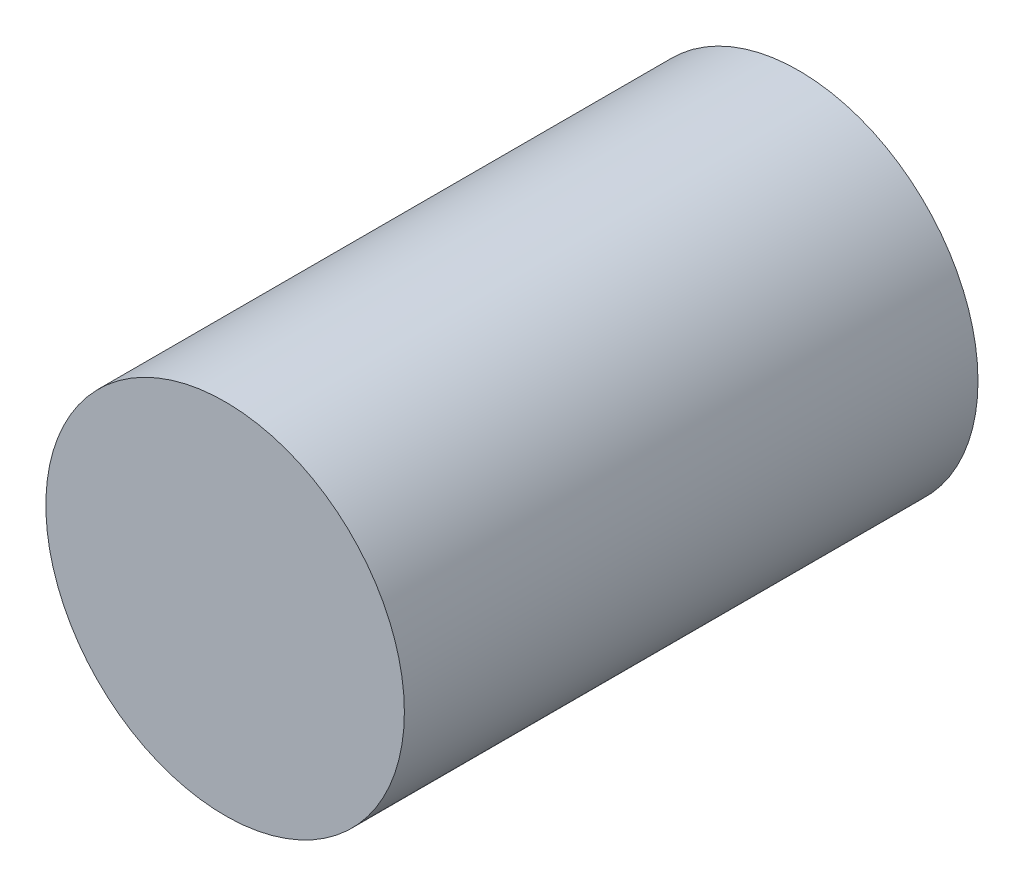
ISO-10303-21;
HEADER;
FILE_DESCRIPTION(('STEP AP214'),'2;1');
FILE_NAME('part.step','',(''),(''),'','','');
FILE_SCHEMA(('AUTOMOTIVE_DESIGN { 1 0 10303 214 1 1 1 1 }'));
ENDSEC;
DATA;
#1=APPLICATION_CONTEXT('core data for automotive mechanical design processes');
#2=APPLICATION_PROTOCOL_DEFINITION('international standard','automotive_design',2000,#1);
#3=PRODUCT_CONTEXT('',#1,'mechanical');
#4=PRODUCT('Part','Part','',(#3));
#5=PRODUCT_RELATED_PRODUCT_CATEGORY('part','',(#4));
#6=PRODUCT_DEFINITION_FORMATION('','',#4);
#7=PRODUCT_DEFINITION_CONTEXT('part definition',#1,'design');
#8=PRODUCT_DEFINITION('design','',#6,#7);
#9=PRODUCT_DEFINITION_SHAPE('','',#8);
#10=(LENGTH_UNIT() NAMED_UNIT(*) SI_UNIT(.MILLI.,.METRE.));
#11=(NAMED_UNIT(*) PLANE_ANGLE_UNIT() SI_UNIT($,.RADIAN.));
#12=(NAMED_UNIT(*) SI_UNIT($,.STERADIAN.) SOLID_ANGLE_UNIT());
#13=UNCERTAINTY_MEASURE_WITH_UNIT(LENGTH_MEASURE(1.E-05),#10,'distance_accuracy_value','');
#14=(GEOMETRIC_REPRESENTATION_CONTEXT(3) GLOBAL_UNCERTAINTY_ASSIGNED_CONTEXT((#13)) GLOBAL_UNIT_ASSIGNED_CONTEXT((#10,
#11,#12)) REPRESENTATION_CONTEXT('',''));
#15=CARTESIAN_POINT('',(0.,0.,0.));
#16=DIRECTION('',(0.,0.,1.));
#17=DIRECTION('',(1.,0.,0.));
#18=AXIS2_PLACEMENT_3D('',#15,#16,#17);
#19=CARTESIAN_POINT('',(0.,0.,4.8));
#20=DIRECTION('',(0.,0.,-1.));
#21=DIRECTION('',(-1.,0.,0.));
#22=AXIS2_PLACEMENT_3D('',#19,#20,#21);
#23=CYLINDRICAL_SURFACE('',#22,1.5);
#24=CARTESIAN_POINT('',(0.,0.,4.8));
#25=DIRECTION('',(0.,0.,1.));
#26=DIRECTION('',(1.,0.,0.));
#27=AXIS2_PLACEMENT_3D('',#24,#25,#26);
#28=CIRCLE('',#27,1.5);
#29=CARTESIAN_POINT('',(1.5,0.,4.8));
#30=VERTEX_POINT('',#29);
#31=EDGE_CURVE('E10',#30,#30,#28,.T.);
#32=ORIENTED_EDGE('',*,*,#31,.F.);
#33=EDGE_LOOP('',(#32));
#34=FACE_BOUND('',#33,.T.);
#35=CARTESIAN_POINT('',(0.,0.,0.));
#36=DIRECTION('',(0.,0.,1.));
#37=DIRECTION('',(1.,0.,0.));
#38=AXIS2_PLACEMENT_3D('',#35,#36,#37);
#39=CIRCLE('',#38,1.5);
#40=CARTESIAN_POINT('',(1.5,0.,0.));
#41=VERTEX_POINT('',#40);
#42=EDGE_CURVE('E40',#41,#41,#39,.T.);
#43=ORIENTED_EDGE('',*,*,#42,.T.);
#44=EDGE_LOOP('',(#43));
#45=FACE_BOUND('',#44,.T.);
#46=ADVANCED_FACE('F37',(#34,#45),#23,.T.);
#47=CARTESIAN_POINT('',(0.,0.,4.8));
#48=DIRECTION('',(0.,0.,1.));
#49=DIRECTION('',(1.,0.,0.));
#50=AXIS2_PLACEMENT_3D('',#47,#48,#49);
#51=PLANE('',#50);
#52=ORIENTED_EDGE('',*,*,#31,.T.);
#53=EDGE_LOOP('',(#52));
#54=FACE_BOUND('',#53,.T.);
#55=ADVANCED_FACE('F52',(#54),#51,.T.);
#56=CARTESIAN_POINT('',(0.,0.,0.));
#57=DIRECTION('',(0.,0.,1.));
#58=DIRECTION('',(1.,0.,0.));
#59=AXIS2_PLACEMENT_3D('',#56,#57,#58);
#60=PLANE('',#59);
#61=ORIENTED_EDGE('',*,*,#42,.F.);
#62=EDGE_LOOP('',(#61));
#63=FACE_BOUND('',#62,.T.);
#64=ADVANCED_FACE('F50',(#63),#60,.F.);
#65=CLOSED_SHELL('',(#46,#55,#64));
#66=MANIFOLD_SOLID_BREP('B2',#65);
#67=ADVANCED_BREP_SHAPE_REPRESENTATION('',(#18,#66),#14);
#68=SHAPE_DEFINITION_REPRESENTATION(#9,#67);
ENDSEC;
END-ISO-10303-21;
